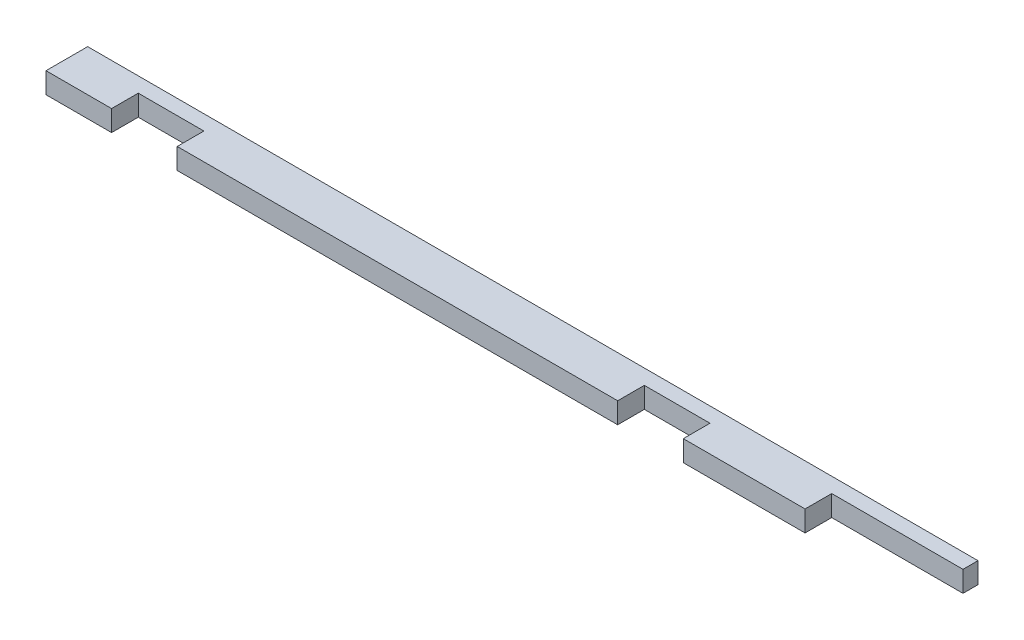
ISO-10303-21;
HEADER;
FILE_DESCRIPTION(('STEP AP214'),'2;1');
FILE_NAME('part.step','',(''),(''),'','','');
FILE_SCHEMA(('AUTOMOTIVE_DESIGN { 1 0 10303 214 1 1 1 1 }'));
ENDSEC;
DATA;
#1=APPLICATION_CONTEXT('core data for automotive mechanical design processes');
#2=APPLICATION_PROTOCOL_DEFINITION('international standard','automotive_design',2000,#1);
#3=PRODUCT_CONTEXT('',#1,'mechanical');
#4=PRODUCT('Part','Part','',(#3));
#5=PRODUCT_RELATED_PRODUCT_CATEGORY('part','',(#4));
#6=PRODUCT_DEFINITION_FORMATION('','',#4);
#7=PRODUCT_DEFINITION_CONTEXT('part definition',#1,'design');
#8=PRODUCT_DEFINITION('design','',#6,#7);
#9=PRODUCT_DEFINITION_SHAPE('','',#8);
#10=(LENGTH_UNIT() NAMED_UNIT(*) SI_UNIT(.MILLI.,.METRE.));
#11=(NAMED_UNIT(*) PLANE_ANGLE_UNIT() SI_UNIT($,.RADIAN.));
#12=(NAMED_UNIT(*) SI_UNIT($,.STERADIAN.) SOLID_ANGLE_UNIT());
#13=UNCERTAINTY_MEASURE_WITH_UNIT(LENGTH_MEASURE(1.E-05),#10,'distance_accuracy_value','');
#14=(GEOMETRIC_REPRESENTATION_CONTEXT(3) GLOBAL_UNCERTAINTY_ASSIGNED_CONTEXT((#13)) GLOBAL_UNIT_ASSIGNED_CONTEXT((#10,
#11,#12)) REPRESENTATION_CONTEXT('',''));
#15=CARTESIAN_POINT('',(0.,0.,0.));
#16=DIRECTION('',(0.,0.,1.));
#17=DIRECTION('',(1.,0.,0.));
#18=AXIS2_PLACEMENT_3D('',#15,#16,#17);
#19=CARTESIAN_POINT('',(0.,1.5875,-3.175));
#20=DIRECTION('',(1.,0.,0.));
#21=DIRECTION('',(0.,0.,-1.));
#22=AXIS2_PLACEMENT_3D('',#19,#20,#21);
#23=PLANE('',#22);
#24=DIRECTION('',(0.,0.,1.));
#25=VECTOR('',#24,1.);
#26=CARTESIAN_POINT('',(0.,0.,-3.175));
#27=LINE('',#26,#25);
#28=CARTESIAN_POINT('',(0.,0.,-3.175));
#29=VERTEX_POINT('',#28);
#30=CARTESIAN_POINT('',(0.,0.,0.));
#31=VERTEX_POINT('',#30);
#32=EDGE_CURVE('E164',#29,#31,#27,.T.);
#33=ORIENTED_EDGE('',*,*,#32,.T.);
#34=DIRECTION('',(0.,-1.,0.));
#35=VECTOR('',#34,1.);
#36=CARTESIAN_POINT('',(0.,1.5875,0.));
#37=LINE('',#36,#35);
#38=CARTESIAN_POINT('',(0.,1.5875,0.));
#39=VERTEX_POINT('',#38);
#40=EDGE_CURVE('E11',#39,#31,#37,.T.);
#41=ORIENTED_EDGE('',*,*,#40,.F.);
#42=DIRECTION('',(0.,0.,1.));
#43=VECTOR('',#42,1.);
#44=CARTESIAN_POINT('',(0.,1.5875,-3.175));
#45=LINE('',#44,#43);
#46=CARTESIAN_POINT('',(0.,1.5875,-3.175));
#47=VERTEX_POINT('',#46);
#48=EDGE_CURVE('E191',#47,#39,#45,.T.);
#49=ORIENTED_EDGE('',*,*,#48,.F.);
#50=DIRECTION('',(0.,-1.,0.));
#51=VECTOR('',#50,1.);
#52=CARTESIAN_POINT('',(0.,1.5875,-3.175));
#53=LINE('',#52,#51);
#54=EDGE_CURVE('E160',#47,#29,#53,.T.);
#55=ORIENTED_EDGE('',*,*,#54,.T.);
#56=EDGE_LOOP('',(#33,#41,#49,#55));
#57=FACE_BOUND('',#56,.T.);
#58=ADVANCED_FACE('F32',(#57),#23,.F.);
#59=CARTESIAN_POINT('',(0.,1.5875,0.));
#60=DIRECTION('',(0.,0.,-1.));
#61=DIRECTION('',(-1.,0.,0.));
#62=AXIS2_PLACEMENT_3D('',#59,#60,#61);
#63=PLANE('',#62);
#64=DIRECTION('',(1.,0.,0.));
#65=VECTOR('',#64,1.);
#66=CARTESIAN_POINT('',(0.,0.,0.));
#67=LINE('',#66,#65);
#68=CARTESIAN_POINT('',(4.99638296756557,0.,0.));
#69=VERTEX_POINT('',#68);
#70=EDGE_CURVE('E167',#31,#69,#67,.T.);
#71=ORIENTED_EDGE('',*,*,#70,.T.);
#72=DIRECTION('',(0.,-1.,0.));
#73=VECTOR('',#72,1.);
#74=CARTESIAN_POINT('',(4.99638296756557,1.5875,0.));
#75=LINE('',#74,#73);
#76=CARTESIAN_POINT('',(4.99638296756557,1.5875,0.));
#77=VERTEX_POINT('',#76);
#78=EDGE_CURVE('E40',#77,#69,#75,.T.);
#79=ORIENTED_EDGE('',*,*,#78,.F.);
#80=DIRECTION('',(1.,0.,0.));
#81=VECTOR('',#80,1.);
#82=CARTESIAN_POINT('',(0.,1.5875,0.));
#83=LINE('',#82,#81);
#84=EDGE_CURVE('E109',#39,#77,#83,.T.);
#85=ORIENTED_EDGE('',*,*,#84,.F.);
#86=ORIENTED_EDGE('',*,*,#40,.T.);
#87=EDGE_LOOP('',(#71,#79,#85,#86));
#88=FACE_BOUND('',#87,.T.);
#89=ADVANCED_FACE('F278',(#88),#63,.F.);
#90=CARTESIAN_POINT('',(4.99638296756557,1.5875,0.));
#91=DIRECTION('',(-1.,0.,0.));
#92=DIRECTION('',(0.,0.,1.));
#93=AXIS2_PLACEMENT_3D('',#90,#91,#92);
#94=PLANE('',#93);
#95=DIRECTION('',(0.,0.,-1.));
#96=VECTOR('',#95,1.);
#97=CARTESIAN_POINT('',(4.99638296756557,0.,0.));
#98=LINE('',#97,#96);
#99=CARTESIAN_POINT('',(4.99638296756557,0.,-2.032));
#100=VERTEX_POINT('',#99);
#101=EDGE_CURVE('E169',#69,#100,#98,.T.);
#102=ORIENTED_EDGE('',*,*,#101,.T.);
#103=DIRECTION('',(0.,-1.,0.));
#104=VECTOR('',#103,1.);
#105=CARTESIAN_POINT('',(4.99638296756557,1.5875,-2.032));
#106=LINE('',#105,#104);
#107=CARTESIAN_POINT('',(4.99638296756557,1.5875,-2.032));
#108=VERTEX_POINT('',#107);
#109=EDGE_CURVE('E216',#108,#100,#106,.T.);
#110=ORIENTED_EDGE('',*,*,#109,.F.);
#111=DIRECTION('',(0.,0.,-1.));
#112=VECTOR('',#111,1.);
#113=CARTESIAN_POINT('',(4.99638296756557,1.5875,0.));
#114=LINE('',#113,#112);
#115=EDGE_CURVE('E224',#77,#108,#114,.T.);
#116=ORIENTED_EDGE('',*,*,#115,.F.);
#117=ORIENTED_EDGE('',*,*,#78,.T.);
#118=EDGE_LOOP('',(#102,#110,#116,#117));
#119=FACE_BOUND('',#118,.T.);
#120=ADVANCED_FACE('F222',(#119),#94,.F.);
#121=CARTESIAN_POINT('',(4.99638296756557,1.5875,-2.032));
#122=DIRECTION('',(0.,0.,-1.));
#123=DIRECTION('',(-1.,0.,0.));
#124=AXIS2_PLACEMENT_3D('',#121,#122,#123);
#125=PLANE('',#124);
#126=DIRECTION('',(1.,0.,0.));
#127=VECTOR('',#126,1.);
#128=CARTESIAN_POINT('',(4.99638296756557,0.,-2.032));
#129=LINE('',#128,#127);
#130=CARTESIAN_POINT('',(9.99510296756557,0.,-2.032));
#131=VERTEX_POINT('',#130);
#132=EDGE_CURVE('E171',#100,#131,#129,.T.);
#133=ORIENTED_EDGE('',*,*,#132,.T.);
#134=DIRECTION('',(0.,-1.,0.));
#135=VECTOR('',#134,1.);
#136=CARTESIAN_POINT('',(9.99510296756557,1.5875,-2.032));
#137=LINE('',#136,#135);
#138=CARTESIAN_POINT('',(9.99510296756557,1.5875,-2.032));
#139=VERTEX_POINT('',#138);
#140=EDGE_CURVE('E213',#139,#131,#137,.T.);
#141=ORIENTED_EDGE('',*,*,#140,.F.);
#142=DIRECTION('',(1.,0.,0.));
#143=VECTOR('',#142,1.);
#144=CARTESIAN_POINT('',(4.99638296756557,1.5875,-2.032));
#145=LINE('',#144,#143);
#146=EDGE_CURVE('E241',#108,#139,#145,.T.);
#147=ORIENTED_EDGE('',*,*,#146,.F.);
#148=ORIENTED_EDGE('',*,*,#109,.T.);
#149=EDGE_LOOP('',(#133,#141,#147,#148));
#150=FACE_BOUND('',#149,.T.);
#151=ADVANCED_FACE('F232',(#150),#125,.F.);
#152=CARTESIAN_POINT('',(9.99510296756557,1.5875,-2.032));
#153=DIRECTION('',(1.,0.,0.));
#154=DIRECTION('',(0.,0.,-1.));
#155=AXIS2_PLACEMENT_3D('',#152,#153,#154);
#156=PLANE('',#155);
#157=DIRECTION('',(0.,0.,1.));
#158=VECTOR('',#157,1.);
#159=CARTESIAN_POINT('',(9.99510296756557,0.,-2.032));
#160=LINE('',#159,#158);
#161=CARTESIAN_POINT('',(9.99510296756557,0.,0.));
#162=VERTEX_POINT('',#161);
#163=EDGE_CURVE('E173',#131,#162,#160,.T.);
#164=ORIENTED_EDGE('',*,*,#163,.T.);
#165=DIRECTION('',(0.,-1.,0.));
#166=VECTOR('',#165,1.);
#167=CARTESIAN_POINT('',(9.99510296756557,1.5875,0.));
#168=LINE('',#167,#166);
#169=CARTESIAN_POINT('',(9.99510296756557,1.5875,0.));
#170=VERTEX_POINT('',#169);
#171=EDGE_CURVE('E210',#170,#162,#168,.T.);
#172=ORIENTED_EDGE('',*,*,#171,.F.);
#173=DIRECTION('',(0.,0.,1.));
#174=VECTOR('',#173,1.);
#175=CARTESIAN_POINT('',(9.99510296756557,1.5875,-2.032));
#176=LINE('',#175,#174);
#177=EDGE_CURVE('E238',#139,#170,#176,.T.);
#178=ORIENTED_EDGE('',*,*,#177,.F.);
#179=ORIENTED_EDGE('',*,*,#140,.T.);
#180=EDGE_LOOP('',(#164,#172,#178,#179));
#181=FACE_BOUND('',#180,.T.);
#182=ADVANCED_FACE('F236',(#181),#156,.F.);
#183=CARTESIAN_POINT('',(29.275630486,1.5875,0.));
#184=DIRECTION('',(0.,0.,-1.));
#185=DIRECTION('',(-1.,0.,0.));
#186=AXIS2_PLACEMENT_3D('',#183,#184,#185);
#187=PLANE('',#186);
#188=DIRECTION('',(1.,0.,0.));
#189=VECTOR('',#188,1.);
#190=CARTESIAN_POINT('',(29.275630486,0.,0.));
#191=LINE('',#190,#189);
#192=CARTESIAN_POINT('',(43.551260812,0.,0.));
#193=VERTEX_POINT('',#192);
#194=EDGE_CURVE('E176',#162,#193,#191,.T.);
#195=ORIENTED_EDGE('',*,*,#194,.T.);
#196=DIRECTION('',(0.,-1.,0.));
#197=VECTOR('',#196,1.);
#198=CARTESIAN_POINT('',(43.551260812,1.5875,0.));
#199=LINE('',#198,#197);
#200=CARTESIAN_POINT('',(43.551260812,1.5875,0.));
#201=VERTEX_POINT('',#200);
#202=EDGE_CURVE('E207',#201,#193,#199,.T.);
#203=ORIENTED_EDGE('',*,*,#202,.F.);
#204=DIRECTION('',(1.,0.,0.));
#205=VECTOR('',#204,1.);
#206=CARTESIAN_POINT('',(19.275630486,1.5875,0.));
#207=LINE('',#206,#205);
#208=EDGE_CURVE('E240',#170,#201,#207,.T.);
#209=ORIENTED_EDGE('',*,*,#208,.F.);
#210=ORIENTED_EDGE('',*,*,#171,.T.);
#211=EDGE_LOOP('',(#195,#203,#209,#210));
#212=FACE_BOUND('',#211,.T.);
#213=ADVANCED_FACE('F291',(#212),#187,.F.);
#214=CARTESIAN_POINT('',(43.551260812,1.5875,0.));
#215=DIRECTION('',(-1.,0.,0.));
#216=DIRECTION('',(0.,0.,1.));
#217=AXIS2_PLACEMENT_3D('',#214,#215,#216);
#218=PLANE('',#217);
#219=DIRECTION('',(0.,0.,-1.));
#220=VECTOR('',#219,1.);
#221=CARTESIAN_POINT('',(43.551260812,0.,0.));
#222=LINE('',#221,#220);
#223=CARTESIAN_POINT('',(43.551260812,0.,-2.032));
#224=VERTEX_POINT('',#223);
#225=EDGE_CURVE('E178',#193,#224,#222,.T.);
#226=ORIENTED_EDGE('',*,*,#225,.T.);
#227=DIRECTION('',(0.,-1.,0.));
#228=VECTOR('',#227,1.);
#229=CARTESIAN_POINT('',(43.551260812,1.5875,-2.032));
#230=LINE('',#229,#228);
#231=CARTESIAN_POINT('',(43.551260812,1.5875,-2.032));
#232=VERTEX_POINT('',#231);
#233=EDGE_CURVE('E204',#232,#224,#230,.T.);
#234=ORIENTED_EDGE('',*,*,#233,.F.);
#235=DIRECTION('',(0.,0.,-1.));
#236=VECTOR('',#235,1.);
#237=CARTESIAN_POINT('',(43.551260812,1.5875,0.));
#238=LINE('',#237,#236);
#239=EDGE_CURVE('E243',#201,#232,#238,.T.);
#240=ORIENTED_EDGE('',*,*,#239,.F.);
#241=ORIENTED_EDGE('',*,*,#202,.T.);
#242=EDGE_LOOP('',(#226,#234,#240,#241));
#243=FACE_BOUND('',#242,.T.);
#244=ADVANCED_FACE('F294',(#243),#218,.F.);
#245=CARTESIAN_POINT('',(43.551260812,1.5875,-2.032));
#246=DIRECTION('',(0.,0.,-1.));
#247=DIRECTION('',(-1.,0.,0.));
#248=AXIS2_PLACEMENT_3D('',#245,#246,#247);
#249=PLANE('',#248);
#250=DIRECTION('',(1.,0.,0.));
#251=VECTOR('',#250,1.);
#252=CARTESIAN_POINT('',(43.551260812,0.,-2.032));
#253=LINE('',#252,#251);
#254=CARTESIAN_POINT('',(48.551260718,0.,-2.032));
#255=VERTEX_POINT('',#254);
#256=EDGE_CURVE('E180',#224,#255,#253,.T.);
#257=ORIENTED_EDGE('',*,*,#256,.T.);
#258=DIRECTION('',(0.,-1.,0.));
#259=VECTOR('',#258,1.);
#260=CARTESIAN_POINT('',(48.551260718,1.5875,-2.032));
#261=LINE('',#260,#259);
#262=CARTESIAN_POINT('',(48.551260718,1.5875,-2.032));
#263=VERTEX_POINT('',#262);
#264=EDGE_CURVE('E201',#263,#255,#261,.T.);
#265=ORIENTED_EDGE('',*,*,#264,.F.);
#266=DIRECTION('',(1.,0.,0.));
#267=VECTOR('',#266,1.);
#268=CARTESIAN_POINT('',(43.551260812,1.5875,-2.032));
#269=LINE('',#268,#267);
#270=EDGE_CURVE('E249',#232,#263,#269,.T.);
#271=ORIENTED_EDGE('',*,*,#270,.F.);
#272=ORIENTED_EDGE('',*,*,#233,.T.);
#273=EDGE_LOOP('',(#257,#265,#271,#272));
#274=FACE_BOUND('',#273,.T.);
#275=ADVANCED_FACE('F298',(#274),#249,.F.);
#276=CARTESIAN_POINT('',(48.551260718,1.5875,-2.032));
#277=DIRECTION('',(1.,0.,0.));
#278=DIRECTION('',(0.,0.,-1.));
#279=AXIS2_PLACEMENT_3D('',#276,#277,#278);
#280=PLANE('',#279);
#281=DIRECTION('',(0.,0.,1.));
#282=VECTOR('',#281,1.);
#283=CARTESIAN_POINT('',(48.551260718,0.,-2.032));
#284=LINE('',#283,#282);
#285=CARTESIAN_POINT('',(48.551260718,0.,0.));
#286=VERTEX_POINT('',#285);
#287=EDGE_CURVE('E182',#255,#286,#284,.T.);
#288=ORIENTED_EDGE('',*,*,#287,.T.);
#289=DIRECTION('',(0.,-1.,0.));
#290=VECTOR('',#289,1.);
#291=CARTESIAN_POINT('',(48.551260718,1.5875,0.));
#292=LINE('',#291,#290);
#293=CARTESIAN_POINT('',(48.551260718,1.5875,0.));
#294=VERTEX_POINT('',#293);
#295=EDGE_CURVE('E198',#294,#286,#292,.T.);
#296=ORIENTED_EDGE('',*,*,#295,.F.);
#297=DIRECTION('',(0.,0.,1.));
#298=VECTOR('',#297,1.);
#299=CARTESIAN_POINT('',(48.551260718,1.5875,-2.032));
#300=LINE('',#299,#298);
#301=EDGE_CURVE('E251',#263,#294,#300,.T.);
#302=ORIENTED_EDGE('',*,*,#301,.F.);
#303=ORIENTED_EDGE('',*,*,#264,.T.);
#304=EDGE_LOOP('',(#288,#296,#302,#303));
#305=FACE_BOUND('',#304,.T.);
#306=ADVANCED_FACE('F302',(#305),#280,.F.);
#307=CARTESIAN_POINT('',(48.551260718,1.5875,0.));
#308=DIRECTION('',(0.,0.,-1.));
#309=DIRECTION('',(-1.,0.,0.));
#310=AXIS2_PLACEMENT_3D('',#307,#308,#309);
#311=PLANE('',#310);
#312=DIRECTION('',(1.,0.,0.));
#313=VECTOR('',#312,1.);
#314=CARTESIAN_POINT('',(48.551260718,0.,0.));
#315=LINE('',#314,#313);
#316=CARTESIAN_POINT('',(57.826891138,0.,0.));
#317=VERTEX_POINT('',#316);
#318=EDGE_CURVE('E184',#286,#317,#315,.T.);
#319=ORIENTED_EDGE('',*,*,#318,.T.);
#320=DIRECTION('',(0.,-1.,0.));
#321=VECTOR('',#320,1.);
#322=CARTESIAN_POINT('',(57.826891138,1.5875,0.));
#323=LINE('',#322,#321);
#324=CARTESIAN_POINT('',(57.826891138,1.5875,0.));
#325=VERTEX_POINT('',#324);
#326=EDGE_CURVE('E195',#325,#317,#323,.T.);
#327=ORIENTED_EDGE('',*,*,#326,.F.);
#328=DIRECTION('',(1.,0.,0.));
#329=VECTOR('',#328,1.);
#330=CARTESIAN_POINT('',(48.551260718,1.5875,0.));
#331=LINE('',#330,#329);
#332=EDGE_CURVE('E253',#294,#325,#331,.T.);
#333=ORIENTED_EDGE('',*,*,#332,.F.);
#334=ORIENTED_EDGE('',*,*,#295,.T.);
#335=EDGE_LOOP('',(#319,#327,#333,#334));
#336=FACE_BOUND('',#335,.T.);
#337=ADVANCED_FACE('F259',(#336),#311,.F.);
#338=CARTESIAN_POINT('',(57.826891138,1.5875,-2.032));
#339=DIRECTION('',(-1.,0.,0.));
#340=DIRECTION('',(0.,0.,1.));
#341=AXIS2_PLACEMENT_3D('',#338,#339,#340);
#342=PLANE('',#341);
#343=DIRECTION('',(0.,0.,-1.));
#344=VECTOR('',#343,1.);
#345=CARTESIAN_POINT('',(57.826891138,0.,-2.032));
#346=LINE('',#345,#344);
#347=CARTESIAN_POINT('',(57.826891138,0.,-2.032));
#348=VERTEX_POINT('',#347);
#349=EDGE_CURVE('E186',#317,#348,#346,.T.);
#350=ORIENTED_EDGE('',*,*,#349,.T.);
#351=DIRECTION('',(0.,-1.,0.));
#352=VECTOR('',#351,1.);
#353=CARTESIAN_POINT('',(57.826891138,1.5875,-2.032));
#354=LINE('',#353,#352);
#355=CARTESIAN_POINT('',(57.826891138,1.5875,-2.032));
#356=VERTEX_POINT('',#355);
#357=EDGE_CURVE('E155',#356,#348,#354,.T.);
#358=ORIENTED_EDGE('',*,*,#357,.F.);
#359=DIRECTION('',(0.,0.,-1.));
#360=VECTOR('',#359,1.);
#361=CARTESIAN_POINT('',(57.826891138,1.5875,-2.032));
#362=LINE('',#361,#360);
#363=EDGE_CURVE('E146',#325,#356,#362,.T.);
#364=ORIENTED_EDGE('',*,*,#363,.F.);
#365=ORIENTED_EDGE('',*,*,#326,.T.);
#366=EDGE_LOOP('',(#350,#358,#364,#365));
#367=FACE_BOUND('',#366,.T.);
#368=ADVANCED_FACE('F263',(#367),#342,.F.);
#369=CARTESIAN_POINT('',(57.826891138,1.5875,-2.032));
#370=DIRECTION('',(0.,0.,-1.));
#371=DIRECTION('',(-1.,0.,0.));
#372=AXIS2_PLACEMENT_3D('',#369,#370,#371);
#373=PLANE('',#372);
#374=DIRECTION('',(1.,0.,0.));
#375=VECTOR('',#374,1.);
#376=CARTESIAN_POINT('',(57.826891138,0.,-2.032));
#377=LINE('',#376,#375);
#378=CARTESIAN_POINT('',(67.826891138,0.,-2.032));
#379=VERTEX_POINT('',#378);
#380=EDGE_CURVE('E154',#348,#379,#377,.T.);
#381=ORIENTED_EDGE('',*,*,#380,.T.);
#382=DIRECTION('',(0.,-1.,0.));
#383=VECTOR('',#382,1.);
#384=CARTESIAN_POINT('',(67.826891138,1.5875,-2.032));
#385=LINE('',#384,#383);
#386=CARTESIAN_POINT('',(67.826891138,1.5875,-2.032));
#387=VERTEX_POINT('',#386);
#388=EDGE_CURVE('E151',#387,#379,#385,.T.);
#389=ORIENTED_EDGE('',*,*,#388,.F.);
#390=DIRECTION('',(1.,0.,0.));
#391=VECTOR('',#390,1.);
#392=CARTESIAN_POINT('',(57.826891138,1.5875,-2.032));
#393=LINE('',#392,#391);
#394=EDGE_CURVE('E140',#356,#387,#393,.T.);
#395=ORIENTED_EDGE('',*,*,#394,.F.);
#396=ORIENTED_EDGE('',*,*,#357,.T.);
#397=EDGE_LOOP('',(#381,#389,#395,#396));
#398=FACE_BOUND('',#397,.T.);
#399=ADVANCED_FACE('F152',(#398),#373,.F.);
#400=CARTESIAN_POINT('',(67.826891138,1.5875,-2.032));
#401=DIRECTION('',(-1.,0.,0.));
#402=DIRECTION('',(0.,0.,1.));
#403=AXIS2_PLACEMENT_3D('',#400,#401,#402);
#404=PLANE('',#403);
#405=DIRECTION('',(0.,0.,-1.));
#406=VECTOR('',#405,1.);
#407=CARTESIAN_POINT('',(67.826891138,0.,-2.032));
#408=LINE('',#407,#406);
#409=CARTESIAN_POINT('',(67.826891138,0.,-3.175));
#410=VERTEX_POINT('',#409);
#411=EDGE_CURVE('E95',#379,#410,#408,.T.);
#412=ORIENTED_EDGE('',*,*,#411,.T.);
#413=DIRECTION('',(0.,-1.,0.));
#414=VECTOR('',#413,1.);
#415=CARTESIAN_POINT('',(67.826891138,1.5875,-3.175));
#416=LINE('',#415,#414);
#417=CARTESIAN_POINT('',(67.826891138,1.5875,-3.175));
#418=VERTEX_POINT('',#417);
#419=EDGE_CURVE('E156',#418,#410,#416,.T.);
#420=ORIENTED_EDGE('',*,*,#419,.F.);
#421=DIRECTION('',(0.,0.,-1.));
#422=VECTOR('',#421,1.);
#423=CARTESIAN_POINT('',(67.826891138,1.5875,-2.032));
#424=LINE('',#423,#422);
#425=EDGE_CURVE('E144',#387,#418,#424,.T.);
#426=ORIENTED_EDGE('',*,*,#425,.F.);
#427=ORIENTED_EDGE('',*,*,#388,.T.);
#428=EDGE_LOOP('',(#412,#420,#426,#427));
#429=FACE_BOUND('',#428,.T.);
#430=ADVANCED_FACE('F158',(#429),#404,.F.);
#431=CARTESIAN_POINT('',(0.,1.5875,-3.175));
#432=DIRECTION('',(0.,0.,1.));
#433=DIRECTION('',(1.,0.,0.));
#434=AXIS2_PLACEMENT_3D('',#431,#432,#433);
#435=PLANE('',#434);
#436=DIRECTION('',(-1.,0.,0.));
#437=VECTOR('',#436,1.);
#438=CARTESIAN_POINT('',(0.,0.,-3.175));
#439=LINE('',#438,#437);
#440=EDGE_CURVE('E101',#410,#29,#439,.T.);
#441=ORIENTED_EDGE('',*,*,#440,.T.);
#442=ORIENTED_EDGE('',*,*,#54,.F.);
#443=DIRECTION('',(-1.,0.,0.));
#444=VECTOR('',#443,1.);
#445=CARTESIAN_POINT('',(0.,1.5875,-3.175));
#446=LINE('',#445,#444);
#447=EDGE_CURVE('E48',#418,#47,#446,.T.);
#448=ORIENTED_EDGE('',*,*,#447,.F.);
#449=ORIENTED_EDGE('',*,*,#419,.T.);
#450=EDGE_LOOP('',(#441,#442,#448,#449));
#451=FACE_BOUND('',#450,.T.);
#452=ADVANCED_FACE('F267',(#451),#435,.F.);
#453=CARTESIAN_POINT('',(0.,1.5875,0.));
#454=DIRECTION('',(0.,1.,0.));
#455=DIRECTION('',(0.,0.,1.));
#456=AXIS2_PLACEMENT_3D('',#453,#454,#455);
#457=PLANE('',#456);
#458=ORIENTED_EDGE('',*,*,#48,.T.);
#459=ORIENTED_EDGE('',*,*,#84,.T.);
#460=ORIENTED_EDGE('',*,*,#115,.T.);
#461=ORIENTED_EDGE('',*,*,#146,.T.);
#462=ORIENTED_EDGE('',*,*,#177,.T.);
#463=ORIENTED_EDGE('',*,*,#208,.T.);
#464=ORIENTED_EDGE('',*,*,#239,.T.);
#465=ORIENTED_EDGE('',*,*,#270,.T.);
#466=ORIENTED_EDGE('',*,*,#301,.T.);
#467=ORIENTED_EDGE('',*,*,#332,.T.);
#468=ORIENTED_EDGE('',*,*,#363,.T.);
#469=ORIENTED_EDGE('',*,*,#394,.T.);
#470=ORIENTED_EDGE('',*,*,#425,.T.);
#471=ORIENTED_EDGE('',*,*,#447,.T.);
#472=EDGE_LOOP('',(#458,#459,#460,#461,#462,#463,#464,#465,#466,#467,#468,#469,#470,#471));
#473=FACE_BOUND('',#472,.T.);
#474=ADVANCED_FACE('F142',(#473),#457,.T.);
#475=CARTESIAN_POINT('',(0.,0.,0.));
#476=DIRECTION('',(0.,1.,0.));
#477=DIRECTION('',(0.,0.,1.));
#478=AXIS2_PLACEMENT_3D('',#475,#476,#477);
#479=PLANE('',#478);
#480=ORIENTED_EDGE('',*,*,#32,.F.);
#481=ORIENTED_EDGE('',*,*,#440,.F.);
#482=ORIENTED_EDGE('',*,*,#411,.F.);
#483=ORIENTED_EDGE('',*,*,#380,.F.);
#484=ORIENTED_EDGE('',*,*,#349,.F.);
#485=ORIENTED_EDGE('',*,*,#318,.F.);
#486=ORIENTED_EDGE('',*,*,#287,.F.);
#487=ORIENTED_EDGE('',*,*,#256,.F.);
#488=ORIENTED_EDGE('',*,*,#225,.F.);
#489=ORIENTED_EDGE('',*,*,#194,.F.);
#490=ORIENTED_EDGE('',*,*,#163,.F.);
#491=ORIENTED_EDGE('',*,*,#132,.F.);
#492=ORIENTED_EDGE('',*,*,#101,.F.);
#493=ORIENTED_EDGE('',*,*,#70,.F.);
#494=EDGE_LOOP('',(#480,#481,#482,#483,#484,#485,#486,#487,#488,#489,#490,#491,#492,#493));
#495=FACE_BOUND('',#494,.T.);
#496=ADVANCED_FACE('F228',(#495),#479,.F.);
#497=CLOSED_SHELL('',(#58,#89,#120,#151,#182,#213,#244,#275,#306,#337,#368,#399,#430,#452,#474,#496));
#498=MANIFOLD_SOLID_BREP('B2',#497);
#499=ADVANCED_BREP_SHAPE_REPRESENTATION('',(#18,#498),#14);
#500=SHAPE_DEFINITION_REPRESENTATION(#9,#499);
ENDSEC;
END-ISO-10303-21;
